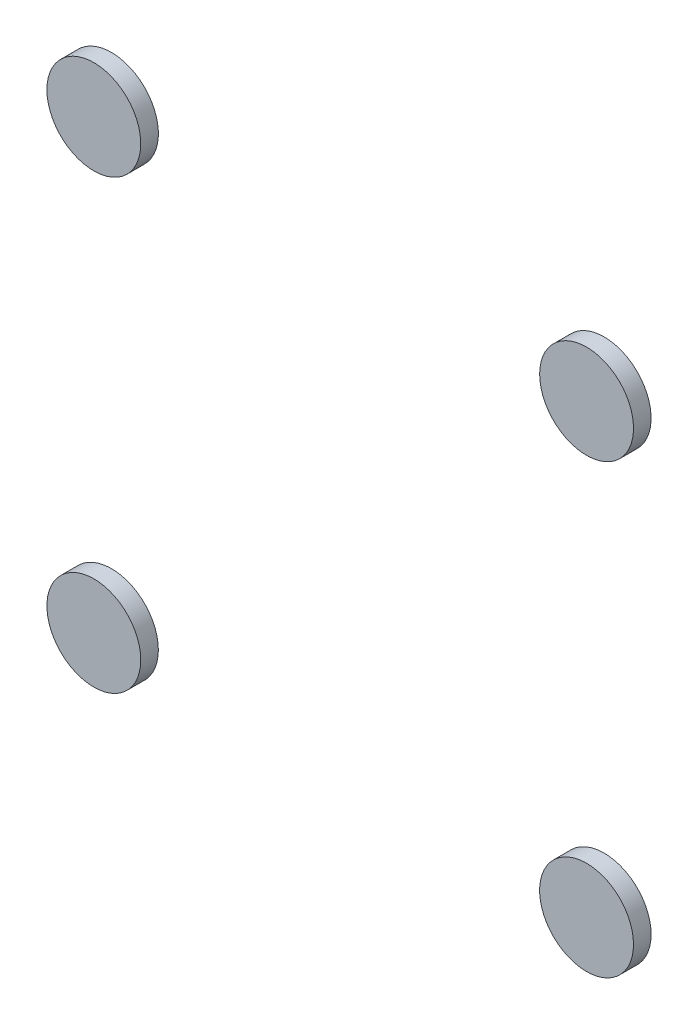
ISO-10303-21;
HEADER;
FILE_DESCRIPTION(('STEP AP214'),'2;1');
FILE_NAME('part.step','',(''),(''),'','','');
FILE_SCHEMA(('AUTOMOTIVE_DESIGN { 1 0 10303 214 1 1 1 1 }'));
ENDSEC;
DATA;
#1=APPLICATION_CONTEXT('core data for automotive mechanical design processes');
#2=APPLICATION_PROTOCOL_DEFINITION('international standard','automotive_design',2000,#1);
#3=PRODUCT_CONTEXT('',#1,'mechanical');
#4=PRODUCT('Part','Part','',(#3));
#5=PRODUCT_RELATED_PRODUCT_CATEGORY('part','',(#4));
#6=PRODUCT_DEFINITION_FORMATION('','',#4);
#7=PRODUCT_DEFINITION_CONTEXT('part definition',#1,'design');
#8=PRODUCT_DEFINITION('design','',#6,#7);
#9=PRODUCT_DEFINITION_SHAPE('','',#8);
#10=(LENGTH_UNIT() NAMED_UNIT(*) SI_UNIT(.MILLI.,.METRE.));
#11=(NAMED_UNIT(*) PLANE_ANGLE_UNIT() SI_UNIT($,.RADIAN.));
#12=(NAMED_UNIT(*) SI_UNIT($,.STERADIAN.) SOLID_ANGLE_UNIT());
#13=UNCERTAINTY_MEASURE_WITH_UNIT(LENGTH_MEASURE(1.E-05),#10,'distance_accuracy_value','');
#14=(GEOMETRIC_REPRESENTATION_CONTEXT(3) GLOBAL_UNCERTAINTY_ASSIGNED_CONTEXT((#13)) GLOBAL_UNIT_ASSIGNED_CONTEXT((#10,
#11,#12)) REPRESENTATION_CONTEXT('',''));
#15=CARTESIAN_POINT('',(0.,0.,0.));
#16=DIRECTION('',(0.,0.,1.));
#17=DIRECTION('',(1.,0.,0.));
#18=AXIS2_PLACEMENT_3D('',#15,#16,#17);
#19=CARTESIAN_POINT('',(11.,19.0525588832577,1.5));
#20=DIRECTION('',(0.,0.,-1.));
#21=DIRECTION('',(-1.,0.,0.));
#22=AXIS2_PLACEMENT_3D('',#19,#20,#21);
#23=CYLINDRICAL_SURFACE('',#22,4.);
#24=CARTESIAN_POINT('',(11.,19.0525588832577,1.5));
#25=DIRECTION('',(0.,0.,1.));
#26=DIRECTION('',(-1.,0.,0.));
#27=AXIS2_PLACEMENT_3D('',#24,#25,#26);
#28=CIRCLE('',#27,4.);
#29=CARTESIAN_POINT('',(6.99999999999996,19.0525588832577,1.5));
#30=VERTEX_POINT('',#29);
#31=EDGE_CURVE('E11',#30,#30,#28,.T.);
#32=ORIENTED_EDGE('',*,*,#31,.F.);
#33=EDGE_LOOP('',(#32));
#34=FACE_BOUND('',#33,.T.);
#35=CARTESIAN_POINT('',(11.,19.0525588832577,0.));
#36=DIRECTION('',(0.,0.,1.));
#37=DIRECTION('',(-1.,0.,0.));
#38=AXIS2_PLACEMENT_3D('',#35,#36,#37);
#39=CIRCLE('',#38,4.);
#40=CARTESIAN_POINT('',(6.99999999999996,19.0525588832577,0.));
#41=VERTEX_POINT('',#40);
#42=EDGE_CURVE('E45',#41,#41,#39,.T.);
#43=ORIENTED_EDGE('',*,*,#42,.T.);
#44=EDGE_LOOP('',(#43));
#45=FACE_BOUND('',#44,.T.);
#46=ADVANCED_FACE('F42',(#34,#45),#23,.T.);
#47=CARTESIAN_POINT('',(11.,19.0525588832577,1.5));
#48=DIRECTION('',(0.,0.,-1.));
#49=DIRECTION('',(-1.,0.,0.));
#50=AXIS2_PLACEMENT_3D('',#47,#48,#49);
#51=PLANE('',#50);
#52=ORIENTED_EDGE('',*,*,#31,.T.);
#53=EDGE_LOOP('',(#52));
#54=FACE_BOUND('',#53,.T.);
#55=ADVANCED_FACE('F57',(#54),#51,.F.);
#56=CARTESIAN_POINT('',(11.,19.0525588832577,0.));
#57=DIRECTION('',(0.,0.,-1.));
#58=DIRECTION('',(-1.,0.,0.));
#59=AXIS2_PLACEMENT_3D('',#56,#57,#58);
#60=PLANE('',#59);
#61=ORIENTED_EDGE('',*,*,#42,.F.);
#62=EDGE_LOOP('',(#61));
#63=FACE_BOUND('',#62,.T.);
#64=ADVANCED_FACE('F55',(#63),#60,.T.);
#65=CLOSED_SHELL('',(#46,#55,#64));
#66=MANIFOLD_SOLID_BREP('B2',#65);
#67=CARTESIAN_POINT('',(-31.0000000000001,19.0525588832576,1.5));
#68=DIRECTION('',(0.,0.,-1.));
#69=DIRECTION('',(-1.,0.,0.));
#70=AXIS2_PLACEMENT_3D('',#67,#68,#69);
#71=CYLINDRICAL_SURFACE('',#70,4.00000000000001);
#72=CARTESIAN_POINT('',(-31.0000000000001,19.0525588832576,1.5));
#73=DIRECTION('',(0.,0.,1.));
#74=DIRECTION('',(-1.,0.,0.));
#75=AXIS2_PLACEMENT_3D('',#72,#73,#74);
#76=CIRCLE('',#75,4.00000000000001);
#77=CARTESIAN_POINT('',(-35.0000000000001,19.0525588832576,1.5));
#78=VERTEX_POINT('',#77);
#79=EDGE_CURVE('E41',#78,#78,#76,.T.);
#80=ORIENTED_EDGE('',*,*,#79,.F.);
#81=EDGE_LOOP('',(#80));
#82=FACE_BOUND('',#81,.T.);
#83=CARTESIAN_POINT('',(-31.0000000000001,19.0525588832576,0.));
#84=DIRECTION('',(0.,0.,1.));
#85=DIRECTION('',(-1.,0.,0.));
#86=AXIS2_PLACEMENT_3D('',#83,#84,#85);
#87=CIRCLE('',#86,4.00000000000001);
#88=CARTESIAN_POINT('',(-35.0000000000001,19.0525588832576,0.));
#89=VERTEX_POINT('',#88);
#90=EDGE_CURVE('E94',#89,#89,#87,.T.);
#91=ORIENTED_EDGE('',*,*,#90,.T.);
#92=EDGE_LOOP('',(#91));
#93=FACE_BOUND('',#92,.T.);
#94=ADVANCED_FACE('F91',(#82,#93),#71,.T.);
#95=CARTESIAN_POINT('',(-31.0000000000001,19.0525588832576,1.5));
#96=DIRECTION('',(0.,0.,-1.));
#97=DIRECTION('',(-1.,0.,0.));
#98=AXIS2_PLACEMENT_3D('',#95,#96,#97);
#99=PLANE('',#98);
#100=ORIENTED_EDGE('',*,*,#79,.T.);
#101=EDGE_LOOP('',(#100));
#102=FACE_BOUND('',#101,.T.);
#103=ADVANCED_FACE('F106',(#102),#99,.F.);
#104=CARTESIAN_POINT('',(-31.0000000000001,19.0525588832576,0.));
#105=DIRECTION('',(0.,0.,-1.));
#106=DIRECTION('',(-1.,0.,0.));
#107=AXIS2_PLACEMENT_3D('',#104,#105,#106);
#108=PLANE('',#107);
#109=ORIENTED_EDGE('',*,*,#90,.F.);
#110=EDGE_LOOP('',(#109));
#111=FACE_BOUND('',#110,.T.);
#112=ADVANCED_FACE('F104',(#111),#108,.T.);
#113=CLOSED_SHELL('',(#94,#103,#112));
#114=MANIFOLD_SOLID_BREP('B6',#113);
#115=CARTESIAN_POINT('',(-31.0000000000001,-19.0525588832576,1.5));
#116=DIRECTION('',(0.,0.,-1.));
#117=DIRECTION('',(-1.,0.,0.));
#118=AXIS2_PLACEMENT_3D('',#115,#116,#117);
#119=CYLINDRICAL_SURFACE('',#118,4.);
#120=CARTESIAN_POINT('',(-31.0000000000001,-19.0525588832576,1.5));
#121=DIRECTION('',(0.,0.,1.));
#122=DIRECTION('',(1.,0.,0.));
#123=AXIS2_PLACEMENT_3D('',#120,#121,#122);
#124=CIRCLE('',#123,4.);
#125=CARTESIAN_POINT('',(-27.0000000000001,-19.0525588832576,1.5));
#126=VERTEX_POINT('',#125);
#127=EDGE_CURVE('E90',#126,#126,#124,.T.);
#128=ORIENTED_EDGE('',*,*,#127,.F.);
#129=EDGE_LOOP('',(#128));
#130=FACE_BOUND('',#129,.T.);
#131=CARTESIAN_POINT('',(-31.0000000000001,-19.0525588832576,0.));
#132=DIRECTION('',(0.,0.,1.));
#133=DIRECTION('',(1.,0.,0.));
#134=AXIS2_PLACEMENT_3D('',#131,#132,#133);
#135=CIRCLE('',#134,4.);
#136=CARTESIAN_POINT('',(-27.0000000000001,-19.0525588832576,0.));
#137=VERTEX_POINT('',#136);
#138=EDGE_CURVE('E142',#137,#137,#135,.T.);
#139=ORIENTED_EDGE('',*,*,#138,.T.);
#140=EDGE_LOOP('',(#139));
#141=FACE_BOUND('',#140,.T.);
#142=ADVANCED_FACE('F139',(#130,#141),#119,.T.);
#143=CARTESIAN_POINT('',(-31.0000000000001,-19.0525588832576,1.5));
#144=DIRECTION('',(0.,0.,1.));
#145=DIRECTION('',(1.,0.,0.));
#146=AXIS2_PLACEMENT_3D('',#143,#144,#145);
#147=PLANE('',#146);
#148=ORIENTED_EDGE('',*,*,#127,.T.);
#149=EDGE_LOOP('',(#148));
#150=FACE_BOUND('',#149,.T.);
#151=ADVANCED_FACE('F154',(#150),#147,.T.);
#152=CARTESIAN_POINT('',(-31.0000000000001,-19.0525588832576,0.));
#153=DIRECTION('',(0.,0.,1.));
#154=DIRECTION('',(1.,0.,0.));
#155=AXIS2_PLACEMENT_3D('',#152,#153,#154);
#156=PLANE('',#155);
#157=ORIENTED_EDGE('',*,*,#138,.F.);
#158=EDGE_LOOP('',(#157));
#159=FACE_BOUND('',#158,.T.);
#160=ADVANCED_FACE('F152',(#159),#156,.F.);
#161=CLOSED_SHELL('',(#142,#151,#160));
#162=MANIFOLD_SOLID_BREP('B36',#161);
#163=CARTESIAN_POINT('',(11.,-19.0525588832577,1.5));
#164=DIRECTION('',(0.,0.,-1.));
#165=DIRECTION('',(-1.,0.,0.));
#166=AXIS2_PLACEMENT_3D('',#163,#164,#165);
#167=CYLINDRICAL_SURFACE('',#166,4.);
#168=CARTESIAN_POINT('',(11.,-19.0525588832577,1.5));
#169=DIRECTION('',(0.,0.,1.));
#170=DIRECTION('',(1.,0.,0.));
#171=AXIS2_PLACEMENT_3D('',#168,#169,#170);
#172=CIRCLE('',#171,4.);
#173=CARTESIAN_POINT('',(15.,-19.0525588832577,1.5));
#174=VERTEX_POINT('',#173);
#175=EDGE_CURVE('E138',#174,#174,#172,.T.);
#176=ORIENTED_EDGE('',*,*,#175,.F.);
#177=EDGE_LOOP('',(#176));
#178=FACE_BOUND('',#177,.T.);
#179=CARTESIAN_POINT('',(11.,-19.0525588832577,0.));
#180=DIRECTION('',(0.,0.,1.));
#181=DIRECTION('',(1.,0.,0.));
#182=AXIS2_PLACEMENT_3D('',#179,#180,#181);
#183=CIRCLE('',#182,4.);
#184=CARTESIAN_POINT('',(15.,-19.0525588832577,0.));
#185=VERTEX_POINT('',#184);
#186=EDGE_CURVE('E183',#185,#185,#183,.T.);
#187=ORIENTED_EDGE('',*,*,#186,.T.);
#188=EDGE_LOOP('',(#187));
#189=FACE_BOUND('',#188,.T.);
#190=ADVANCED_FACE('F180',(#178,#189),#167,.T.);
#191=CARTESIAN_POINT('',(11.,-19.0525588832577,1.5));
#192=DIRECTION('',(0.,0.,1.));
#193=DIRECTION('',(1.,0.,0.));
#194=AXIS2_PLACEMENT_3D('',#191,#192,#193);
#195=PLANE('',#194);
#196=ORIENTED_EDGE('',*,*,#175,.T.);
#197=EDGE_LOOP('',(#196));
#198=FACE_BOUND('',#197,.T.);
#199=ADVANCED_FACE('F195',(#198),#195,.T.);
#200=CARTESIAN_POINT('',(11.,-19.0525588832577,0.));
#201=DIRECTION('',(0.,0.,1.));
#202=DIRECTION('',(1.,0.,0.));
#203=AXIS2_PLACEMENT_3D('',#200,#201,#202);
#204=PLANE('',#203);
#205=ORIENTED_EDGE('',*,*,#186,.F.);
#206=EDGE_LOOP('',(#205));
#207=FACE_BOUND('',#206,.T.);
#208=ADVANCED_FACE('F193',(#207),#204,.F.);
#209=CLOSED_SHELL('',(#190,#199,#208));
#210=MANIFOLD_SOLID_BREP('B85',#209);
#211=ADVANCED_BREP_SHAPE_REPRESENTATION('',(#18,#66,#114,#162,#210),#14);
#212=SHAPE_DEFINITION_REPRESENTATION(#9,#211);
ENDSEC;
END-ISO-10303-21;
